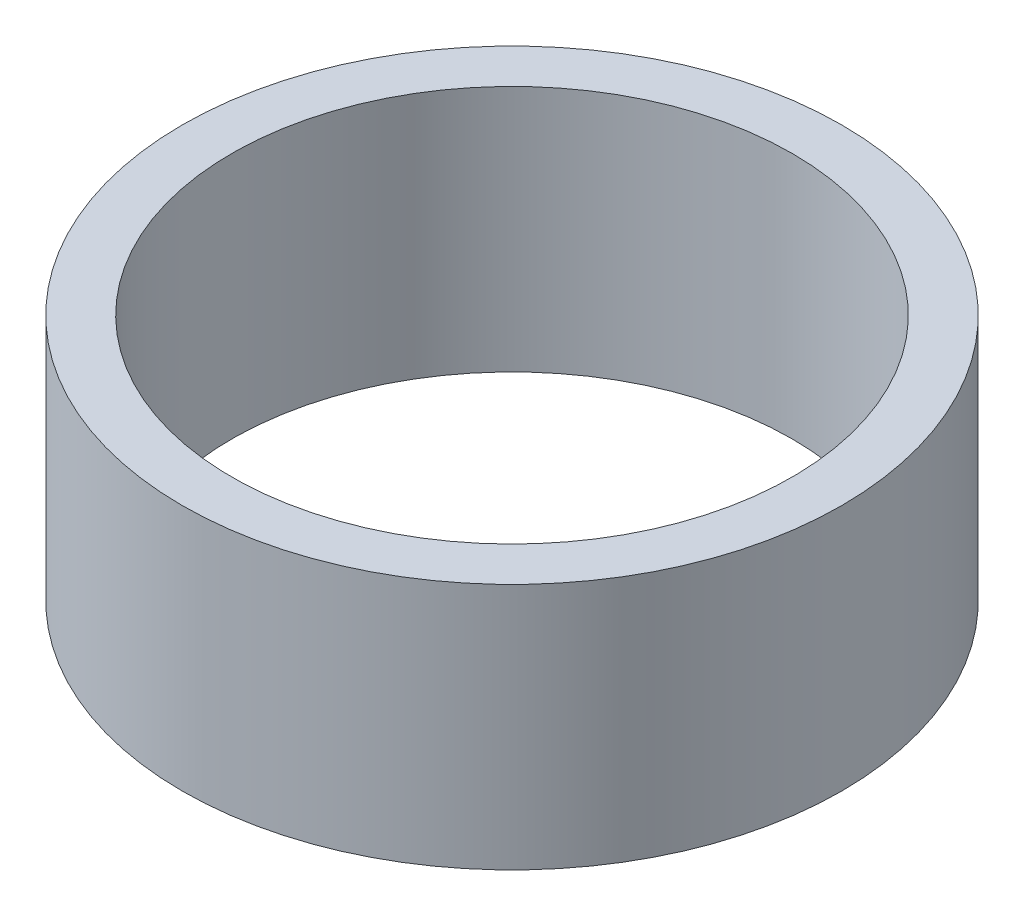
ISO-10303-21;
HEADER;
FILE_DESCRIPTION(('STEP AP214'),'2;1');
FILE_NAME('part.step','',(''),(''),'','','');
FILE_SCHEMA(('AUTOMOTIVE_DESIGN { 1 0 10303 214 1 1 1 1 }'));
ENDSEC;
DATA;
#1=APPLICATION_CONTEXT('core data for automotive mechanical design processes');
#2=APPLICATION_PROTOCOL_DEFINITION('international standard','automotive_design',2000,#1);
#3=PRODUCT_CONTEXT('',#1,'mechanical');
#4=PRODUCT('Part','Part','',(#3));
#5=PRODUCT_RELATED_PRODUCT_CATEGORY('part','',(#4));
#6=PRODUCT_DEFINITION_FORMATION('','',#4);
#7=PRODUCT_DEFINITION_CONTEXT('part definition',#1,'design');
#8=PRODUCT_DEFINITION('design','',#6,#7);
#9=PRODUCT_DEFINITION_SHAPE('','',#8);
#10=(LENGTH_UNIT() NAMED_UNIT(*) SI_UNIT(.MILLI.,.METRE.));
#11=(NAMED_UNIT(*) PLANE_ANGLE_UNIT() SI_UNIT($,.RADIAN.));
#12=(NAMED_UNIT(*) SI_UNIT($,.STERADIAN.) SOLID_ANGLE_UNIT());
#13=UNCERTAINTY_MEASURE_WITH_UNIT(LENGTH_MEASURE(1.E-05),#10,'distance_accuracy_value','');
#14=(GEOMETRIC_REPRESENTATION_CONTEXT(3) GLOBAL_UNCERTAINTY_ASSIGNED_CONTEXT((#13)) GLOBAL_UNIT_ASSIGNED_CONTEXT((#10,
#11,#12)) REPRESENTATION_CONTEXT('',''));
#15=CARTESIAN_POINT('',(0.,0.,0.));
#16=DIRECTION('',(0.,0.,1.));
#17=DIRECTION('',(1.,0.,0.));
#18=AXIS2_PLACEMENT_3D('',#15,#16,#17);
#19=CARTESIAN_POINT('',(0.,19.05,0.));
#20=DIRECTION('',(0.,-1.,0.));
#21=DIRECTION('',(0.,0.,-1.));
#22=AXIS2_PLACEMENT_3D('',#19,#20,#21);
#23=CYLINDRICAL_SURFACE('',#22,43.18);
#24=CARTESIAN_POINT('',(0.,-19.05,0.));
#25=DIRECTION('',(0.,-1.,0.));
#26=DIRECTION('',(0.,0.,-1.));
#27=AXIS2_PLACEMENT_3D('',#24,#25,#26);
#28=CIRCLE('',#27,43.18);
#29=CARTESIAN_POINT('',(0.,-19.05,-43.18));
#30=VERTEX_POINT('',#29);
#31=EDGE_CURVE('E27',#30,#30,#28,.T.);
#32=ORIENTED_EDGE('',*,*,#31,.T.);
#33=EDGE_LOOP('',(#32));
#34=FACE_BOUND('',#33,.T.);
#35=CARTESIAN_POINT('',(0.,19.05,0.));
#36=DIRECTION('',(0.,-1.,0.));
#37=DIRECTION('',(0.,0.,-1.));
#38=AXIS2_PLACEMENT_3D('',#35,#36,#37);
#39=CIRCLE('',#38,43.18);
#40=CARTESIAN_POINT('',(0.,19.05,-43.18));
#41=VERTEX_POINT('',#40);
#42=EDGE_CURVE('E18',#41,#41,#39,.T.);
#43=ORIENTED_EDGE('',*,*,#42,.F.);
#44=EDGE_LOOP('',(#43));
#45=FACE_BOUND('',#44,.T.);
#46=ADVANCED_FACE('F15',(#34,#45),#23,.F.);
#47=CARTESIAN_POINT('',(0.,19.05,0.));
#48=DIRECTION('',(0.,1.,0.));
#49=DIRECTION('',(0.,0.,1.));
#50=AXIS2_PLACEMENT_3D('',#47,#48,#49);
#51=PLANE('',#50);
#52=ORIENTED_EDGE('',*,*,#42,.T.);
#53=EDGE_LOOP('',(#52));
#54=FACE_BOUND('',#53,.T.);
#55=CARTESIAN_POINT('',(0.,19.05,0.));
#56=DIRECTION('',(0.,-1.,0.));
#57=DIRECTION('',(0.,0.,-1.));
#58=AXIS2_PLACEMENT_3D('',#55,#56,#57);
#59=CIRCLE('',#58,50.8);
#60=CARTESIAN_POINT('',(0.,19.05,-50.8));
#61=VERTEX_POINT('',#60);
#62=EDGE_CURVE('E22',#61,#61,#59,.T.);
#63=ORIENTED_EDGE('',*,*,#62,.F.);
#64=EDGE_LOOP('',(#63));
#65=FACE_BOUND('',#64,.T.);
#66=ADVANCED_FACE('F35',(#54,#65),#51,.T.);
#67=CARTESIAN_POINT('',(0.,-19.05,0.));
#68=DIRECTION('',(0.,1.,0.));
#69=DIRECTION('',(0.,0.,1.));
#70=AXIS2_PLACEMENT_3D('',#67,#68,#69);
#71=PLANE('',#70);
#72=ORIENTED_EDGE('',*,*,#31,.F.);
#73=EDGE_LOOP('',(#72));
#74=FACE_BOUND('',#73,.T.);
#75=CARTESIAN_POINT('',(0.,-19.05,0.));
#76=DIRECTION('',(0.,-1.,0.));
#77=DIRECTION('',(0.,0.,-1.));
#78=AXIS2_PLACEMENT_3D('',#75,#76,#77);
#79=CIRCLE('',#78,50.8);
#80=CARTESIAN_POINT('',(0.,-19.05,-50.8));
#81=VERTEX_POINT('',#80);
#82=EDGE_CURVE('E10',#81,#81,#79,.F.);
#83=ORIENTED_EDGE('',*,*,#82,.F.);
#84=EDGE_LOOP('',(#83));
#85=FACE_BOUND('',#84,.T.);
#86=ADVANCED_FACE('F43',(#74,#85),#71,.F.);
#87=CARTESIAN_POINT('',(0.,19.05,0.));
#88=DIRECTION('',(0.,-1.,0.));
#89=DIRECTION('',(0.,0.,-1.));
#90=AXIS2_PLACEMENT_3D('',#87,#88,#89);
#91=CYLINDRICAL_SURFACE('',#90,50.8);
#92=ORIENTED_EDGE('',*,*,#62,.T.);
#93=EDGE_LOOP('',(#92));
#94=FACE_BOUND('',#93,.T.);
#95=ORIENTED_EDGE('',*,*,#82,.T.);
#96=EDGE_LOOP('',(#95));
#97=FACE_BOUND('',#96,.T.);
#98=ADVANCED_FACE('F44',(#94,#97),#91,.T.);
#99=CLOSED_SHELL('',(#46,#66,#86,#98));
#100=MANIFOLD_SOLID_BREP('B1',#99);
#101=ADVANCED_BREP_SHAPE_REPRESENTATION('',(#18,#100),#14);
#102=SHAPE_DEFINITION_REPRESENTATION(#9,#101);
ENDSEC;
END-ISO-10303-21;
